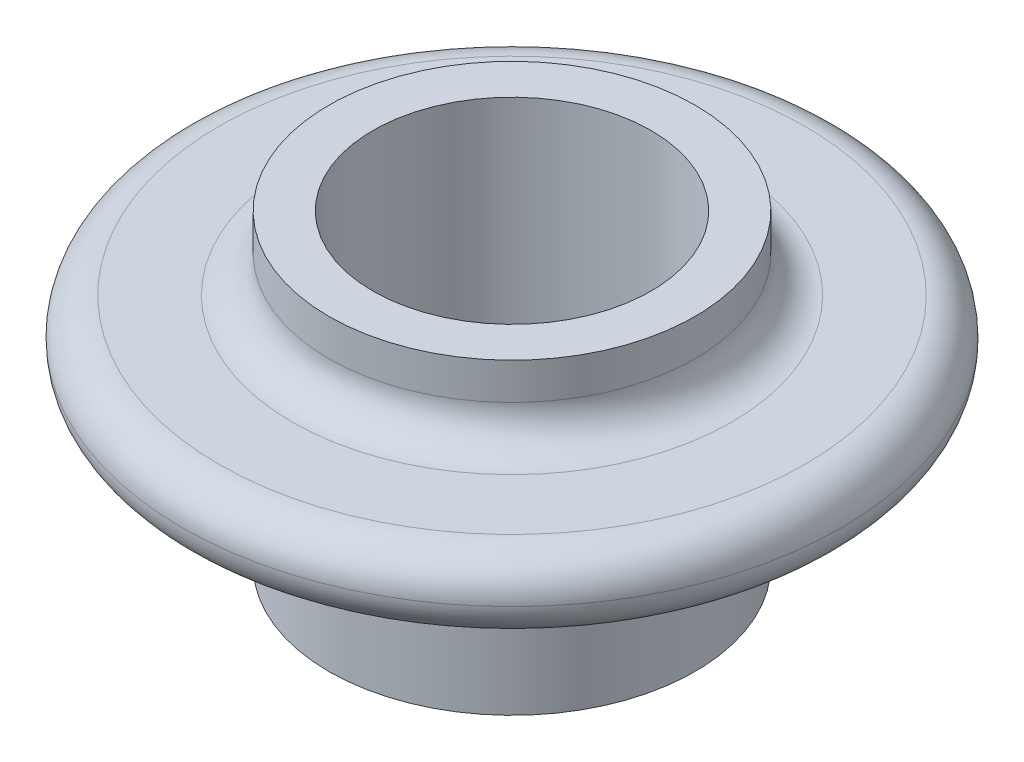
ISO-10303-21;
HEADER;
FILE_DESCRIPTION(('STEP AP214'),'2;1');
FILE_NAME('part.step','',(''),(''),'','','');
FILE_SCHEMA(('AUTOMOTIVE_DESIGN { 1 0 10303 214 1 1 1 1 }'));
ENDSEC;
DATA;
#1=APPLICATION_CONTEXT('core data for automotive mechanical design processes');
#2=APPLICATION_PROTOCOL_DEFINITION('international standard','automotive_design',2000,#1);
#3=PRODUCT_CONTEXT('',#1,'mechanical');
#4=PRODUCT('Part','Part','',(#3));
#5=PRODUCT_RELATED_PRODUCT_CATEGORY('part','',(#4));
#6=PRODUCT_DEFINITION_FORMATION('','',#4);
#7=PRODUCT_DEFINITION_CONTEXT('part definition',#1,'design');
#8=PRODUCT_DEFINITION('design','',#6,#7);
#9=PRODUCT_DEFINITION_SHAPE('','',#8);
#10=(LENGTH_UNIT() NAMED_UNIT(*) SI_UNIT(.MILLI.,.METRE.));
#11=(NAMED_UNIT(*) PLANE_ANGLE_UNIT() SI_UNIT($,.RADIAN.));
#12=(NAMED_UNIT(*) SI_UNIT($,.STERADIAN.) SOLID_ANGLE_UNIT());
#13=UNCERTAINTY_MEASURE_WITH_UNIT(LENGTH_MEASURE(1.E-05),#10,'distance_accuracy_value','');
#14=(GEOMETRIC_REPRESENTATION_CONTEXT(3) GLOBAL_UNCERTAINTY_ASSIGNED_CONTEXT((#13)) GLOBAL_UNIT_ASSIGNED_CONTEXT((#10,
#11,#12)) REPRESENTATION_CONTEXT('',''));
#15=CARTESIAN_POINT('',(0.,0.,0.));
#16=DIRECTION('',(0.,0.,1.));
#17=DIRECTION('',(1.,0.,0.));
#18=AXIS2_PLACEMENT_3D('',#15,#16,#17);
#19=CARTESIAN_POINT('',(25.,0.,0.));
#20=DIRECTION('',(0.,-1.,0.));
#21=DIRECTION('',(0.,0.,-1.));
#22=AXIS2_PLACEMENT_3D('',#19,#20,#21);
#23=PLANE('',#22);
#24=CARTESIAN_POINT('',(0.,0.,0.));
#25=DIRECTION('',(0.,-1.,0.));
#26=DIRECTION('',(0.,0.,-1.));
#27=AXIS2_PLACEMENT_3D('',#24,#25,#26);
#28=CIRCLE('',#27,25.);
#29=CARTESIAN_POINT('',(0.,0.,-25.));
#30=VERTEX_POINT('',#29);
#31=EDGE_CURVE('E72',#30,#30,#28,.T.);
#32=ORIENTED_EDGE('',*,*,#31,.T.);
#33=EDGE_LOOP('',(#32));
#34=FACE_BOUND('',#33,.T.);
#35=CARTESIAN_POINT('',(0.,0.,0.));
#36=DIRECTION('',(0.,-1.,0.));
#37=DIRECTION('',(0.,0.,-1.));
#38=AXIS2_PLACEMENT_3D('',#35,#36,#37);
#39=CIRCLE('',#38,19.);
#40=CARTESIAN_POINT('',(0.,0.,-19.));
#41=VERTEX_POINT('',#40);
#42=EDGE_CURVE('E56',#41,#41,#39,.T.);
#43=ORIENTED_EDGE('',*,*,#42,.F.);
#44=EDGE_LOOP('',(#43));
#45=FACE_BOUND('',#44,.T.);
#46=ADVANCED_FACE('F39',(#34,#45),#23,.T.);
#47=CARTESIAN_POINT('',(0.,0.,0.));
#48=DIRECTION('',(0.,-1.,0.));
#49=DIRECTION('',(0.,0.,-1.));
#50=AXIS2_PLACEMENT_3D('',#47,#48,#49);
#51=CYLINDRICAL_SURFACE('',#50,19.);
#52=ORIENTED_EDGE('',*,*,#42,.T.);
#53=EDGE_LOOP('',(#52));
#54=FACE_BOUND('',#53,.T.);
#55=CARTESIAN_POINT('',(0.,42.,0.));
#56=DIRECTION('',(0.,-1.,0.));
#57=DIRECTION('',(0.,0.,-1.));
#58=AXIS2_PLACEMENT_3D('',#55,#56,#57);
#59=CIRCLE('',#58,19.);
#60=CARTESIAN_POINT('',(0.,42.,-19.));
#61=VERTEX_POINT('',#60);
#62=EDGE_CURVE('E65',#61,#61,#59,.T.);
#63=ORIENTED_EDGE('',*,*,#62,.F.);
#64=EDGE_LOOP('',(#63));
#65=FACE_BOUND('',#64,.T.);
#66=ADVANCED_FACE('F93',(#54,#65),#51,.F.);
#67=CARTESIAN_POINT('',(19.,42.,0.));
#68=DIRECTION('',(0.,1.,0.));
#69=DIRECTION('',(0.,0.,1.));
#70=AXIS2_PLACEMENT_3D('',#67,#68,#69);
#71=PLANE('',#70);
#72=ORIENTED_EDGE('',*,*,#62,.T.);
#73=EDGE_LOOP('',(#72));
#74=FACE_BOUND('',#73,.T.);
#75=CARTESIAN_POINT('',(0.,42.,0.));
#76=DIRECTION('',(0.,-1.,0.));
#77=DIRECTION('',(0.,0.,-1.));
#78=AXIS2_PLACEMENT_3D('',#75,#76,#77);
#79=CIRCLE('',#78,25.);
#80=CARTESIAN_POINT('',(0.,42.,-25.));
#81=VERTEX_POINT('',#80);
#82=EDGE_CURVE('E61',#81,#81,#79,.T.);
#83=ORIENTED_EDGE('',*,*,#82,.F.);
#84=EDGE_LOOP('',(#83));
#85=FACE_BOUND('',#84,.T.);
#86=ADVANCED_FACE('F97',(#74,#85),#71,.T.);
#87=CARTESIAN_POINT('',(0.,0.,0.));
#88=DIRECTION('',(0.,-1.,0.));
#89=DIRECTION('',(0.,0.,-1.));
#90=AXIS2_PLACEMENT_3D('',#87,#88,#89);
#91=CYLINDRICAL_SURFACE('',#90,25.);
#92=CARTESIAN_POINT('',(0.,37.,0.));
#93=DIRECTION('',(0.,1.,0.));
#94=DIRECTION('',(0.,0.,1.));
#95=AXIS2_PLACEMENT_3D('',#92,#93,#94);
#96=CIRCLE('',#95,25.);
#97=CARTESIAN_POINT('',(0.,37.,25.));
#98=VERTEX_POINT('',#97);
#99=EDGE_CURVE('E50',#98,#98,#96,.T.);
#100=ORIENTED_EDGE('',*,*,#99,.T.);
#101=EDGE_LOOP('',(#100));
#102=FACE_BOUND('',#101,.T.);
#103=ORIENTED_EDGE('',*,*,#82,.T.);
#104=EDGE_LOOP('',(#103));
#105=FACE_BOUND('',#104,.T.);
#106=ADVANCED_FACE('F103',(#102,#105),#91,.T.);
#107=CARTESIAN_POINT('',(25.,32.,0.));
#108=DIRECTION('',(0.,1.,0.));
#109=DIRECTION('',(0.,0.,1.));
#110=AXIS2_PLACEMENT_3D('',#107,#108,#109);
#111=PLANE('',#110);
#112=CARTESIAN_POINT('',(0.,32.,0.));
#113=DIRECTION('',(0.,1.,0.));
#114=DIRECTION('',(0.,0.,1.));
#115=AXIS2_PLACEMENT_3D('',#112,#113,#114);
#116=CIRCLE('',#115,30.);
#117=CARTESIAN_POINT('',(0.,32.,30.));
#118=VERTEX_POINT('',#117);
#119=EDGE_CURVE('E51',#118,#118,#116,.F.);
#120=ORIENTED_EDGE('',*,*,#119,.T.);
#121=EDGE_LOOP('',(#120));
#122=FACE_BOUND('',#121,.T.);
#123=CARTESIAN_POINT('',(0.,32.,0.));
#124=DIRECTION('',(0.,1.,0.));
#125=DIRECTION('',(0.,0.,1.));
#126=AXIS2_PLACEMENT_3D('',#123,#124,#125);
#127=CIRCLE('',#126,40.);
#128=CARTESIAN_POINT('',(0.,32.,40.));
#129=VERTEX_POINT('',#128);
#130=EDGE_CURVE('E57',#129,#129,#127,.T.);
#131=ORIENTED_EDGE('',*,*,#130,.T.);
#132=EDGE_LOOP('',(#131));
#133=FACE_BOUND('',#132,.T.);
#134=ADVANCED_FACE('F109',(#122,#133),#111,.T.);
#135=CARTESIAN_POINT('',(45.,22.,0.));
#136=DIRECTION('',(0.,-1.,0.));
#137=DIRECTION('',(0.,0.,-1.));
#138=AXIS2_PLACEMENT_3D('',#135,#136,#137);
#139=PLANE('',#138);
#140=CARTESIAN_POINT('',(0.,22.,0.));
#141=DIRECTION('',(0.,-1.,0.));
#142=DIRECTION('',(0.,0.,-1.));
#143=AXIS2_PLACEMENT_3D('',#140,#141,#142);
#144=CIRCLE('',#143,40.);
#145=CARTESIAN_POINT('',(0.,22.,-40.));
#146=VERTEX_POINT('',#145);
#147=EDGE_CURVE('E10',#146,#146,#144,.T.);
#148=ORIENTED_EDGE('',*,*,#147,.T.);
#149=EDGE_LOOP('',(#148));
#150=FACE_BOUND('',#149,.T.);
#151=CARTESIAN_POINT('',(0.,22.,0.));
#152=DIRECTION('',(0.,-1.,0.));
#153=DIRECTION('',(0.,0.,-1.));
#154=AXIS2_PLACEMENT_3D('',#151,#152,#153);
#155=CIRCLE('',#154,25.);
#156=CARTESIAN_POINT('',(0.,22.,-25.));
#157=VERTEX_POINT('',#156);
#158=EDGE_CURVE('E66',#157,#157,#155,.T.);
#159=ORIENTED_EDGE('',*,*,#158,.F.);
#160=EDGE_LOOP('',(#159));
#161=FACE_BOUND('',#160,.T.);
#162=ADVANCED_FACE('F111',(#150,#161),#139,.T.);
#163=CARTESIAN_POINT('',(0.,0.,0.));
#164=DIRECTION('',(0.,-1.,0.));
#165=DIRECTION('',(0.,0.,-1.));
#166=AXIS2_PLACEMENT_3D('',#163,#164,#165);
#167=CYLINDRICAL_SURFACE('',#166,25.);
#168=ORIENTED_EDGE('',*,*,#158,.T.);
#169=EDGE_LOOP('',(#168));
#170=FACE_BOUND('',#169,.T.);
#171=ORIENTED_EDGE('',*,*,#31,.F.);
#172=EDGE_LOOP('',(#171));
#173=FACE_BOUND('',#172,.T.);
#174=ADVANCED_FACE('F88',(#170,#173),#167,.T.);
#175=CARTESIAN_POINT('',(0.,37.,0.));
#176=DIRECTION('',(0.,1.,0.));
#177=DIRECTION('',(0.,0.,1.));
#178=AXIS2_PLACEMENT_3D('',#175,#176,#177);
#179=TOROIDAL_SURFACE('',#178,30.,5.);
#180=ORIENTED_EDGE('',*,*,#99,.F.);
#181=EDGE_LOOP('',(#180));
#182=FACE_BOUND('',#181,.T.);
#183=ORIENTED_EDGE('',*,*,#119,.F.);
#184=EDGE_LOOP('',(#183));
#185=FACE_BOUND('',#184,.T.);
#186=ADVANCED_FACE('F85',(#182,#185),#179,.F.);
#187=CARTESIAN_POINT('',(0.,27.,0.));
#188=DIRECTION('',(0.,1.,0.));
#189=DIRECTION('',(0.,0.,1.));
#190=AXIS2_PLACEMENT_3D('',#187,#188,#189);
#191=TOROIDAL_SURFACE('',#190,40.,5.);
#192=ORIENTED_EDGE('',*,*,#130,.F.);
#193=EDGE_LOOP('',(#192));
#194=FACE_BOUND('',#193,.T.);
#195=CARTESIAN_POINT('',(0.,27.,0.));
#196=DIRECTION('',(0.,1.,0.));
#197=DIRECTION('',(0.,0.,1.));
#198=AXIS2_PLACEMENT_3D('',#195,#196,#197);
#199=CIRCLE('',#198,45.);
#200=CARTESIAN_POINT('',(0.,27.,45.));
#201=VERTEX_POINT('',#200);
#202=EDGE_CURVE('E43',#201,#201,#199,.F.);
#203=ORIENTED_EDGE('',*,*,#202,.F.);
#204=EDGE_LOOP('',(#203));
#205=FACE_BOUND('',#204,.T.);
#206=ADVANCED_FACE('F41',(#194,#205),#191,.T.);
#207=CARTESIAN_POINT('',(0.,27.,0.));
#208=DIRECTION('',(0.,-1.,0.));
#209=DIRECTION('',(0.,0.,-1.));
#210=AXIS2_PLACEMENT_3D('',#207,#208,#209);
#211=TOROIDAL_SURFACE('',#210,40.,5.);
#212=ORIENTED_EDGE('',*,*,#202,.T.);
#213=EDGE_LOOP('',(#212));
#214=FACE_BOUND('',#213,.T.);
#215=ORIENTED_EDGE('',*,*,#147,.F.);
#216=EDGE_LOOP('',(#215));
#217=FACE_BOUND('',#216,.T.);
#218=ADVANCED_FACE('F76',(#214,#217),#211,.T.);
#219=CLOSED_SHELL('',(#46,#66,#86,#106,#134,#162,#174,#186,#206,#218));
#220=MANIFOLD_SOLID_BREP('B2',#219);
#221=ADVANCED_BREP_SHAPE_REPRESENTATION('',(#18,#220),#14);
#222=SHAPE_DEFINITION_REPRESENTATION(#9,#221);
ENDSEC;
END-ISO-10303-21;
